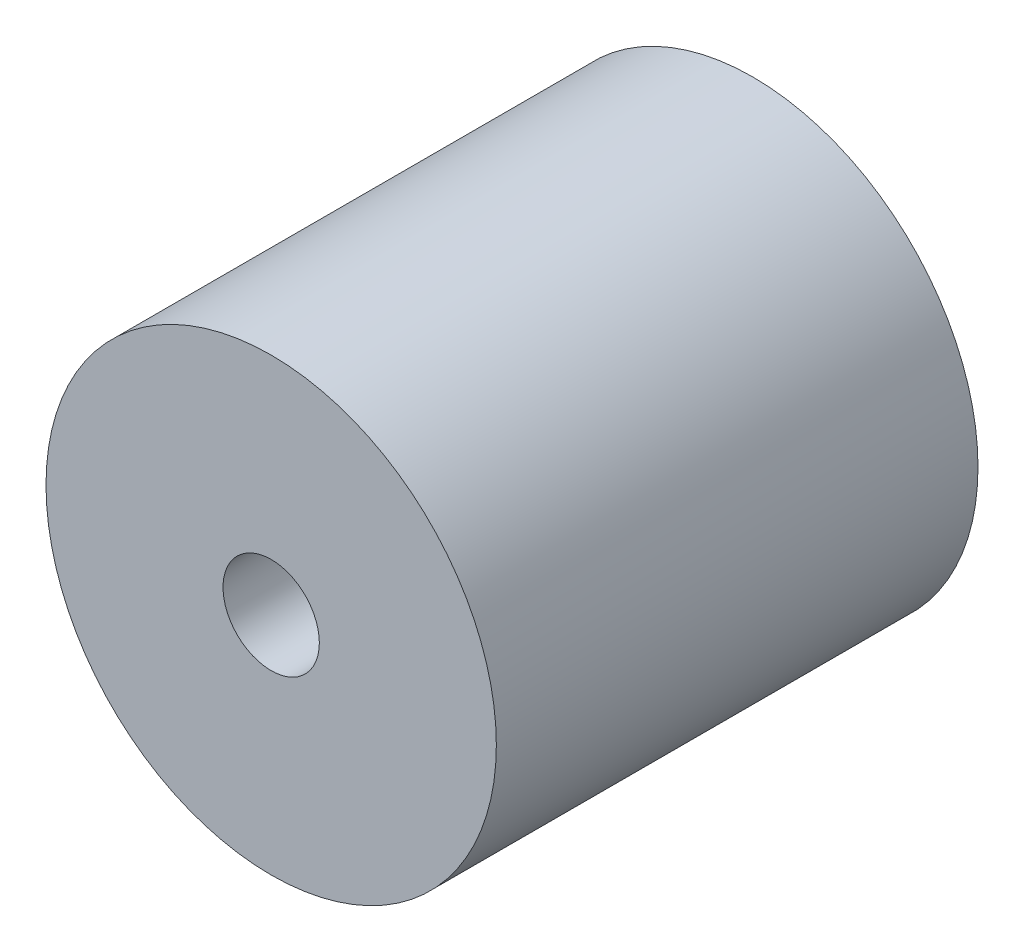
ISO-10303-21;
HEADER;
FILE_DESCRIPTION(('STEP AP214'),'2;1');
FILE_NAME('part.step','',(''),(''),'','','');
FILE_SCHEMA(('AUTOMOTIVE_DESIGN { 1 0 10303 214 1 1 1 1 }'));
ENDSEC;
DATA;
#1=APPLICATION_CONTEXT('core data for automotive mechanical design processes');
#2=APPLICATION_PROTOCOL_DEFINITION('international standard','automotive_design',2000,#1);
#3=PRODUCT_CONTEXT('',#1,'mechanical');
#4=PRODUCT('Part','Part','',(#3));
#5=PRODUCT_RELATED_PRODUCT_CATEGORY('part','',(#4));
#6=PRODUCT_DEFINITION_FORMATION('','',#4);
#7=PRODUCT_DEFINITION_CONTEXT('part definition',#1,'design');
#8=PRODUCT_DEFINITION('design','',#6,#7);
#9=PRODUCT_DEFINITION_SHAPE('','',#8);
#10=(LENGTH_UNIT() NAMED_UNIT(*) SI_UNIT(.MILLI.,.METRE.));
#11=(NAMED_UNIT(*) PLANE_ANGLE_UNIT() SI_UNIT($,.RADIAN.));
#12=(NAMED_UNIT(*) SI_UNIT($,.STERADIAN.) SOLID_ANGLE_UNIT());
#13=UNCERTAINTY_MEASURE_WITH_UNIT(LENGTH_MEASURE(1.E-05),#10,'distance_accuracy_value','');
#14=(GEOMETRIC_REPRESENTATION_CONTEXT(3) GLOBAL_UNCERTAINTY_ASSIGNED_CONTEXT((#13)) GLOBAL_UNIT_ASSIGNED_CONTEXT((#10,
#11,#12)) REPRESENTATION_CONTEXT('',''));
#15=CARTESIAN_POINT('',(0.,0.,0.));
#16=DIRECTION('',(0.,0.,1.));
#17=DIRECTION('',(1.,0.,0.));
#18=AXIS2_PLACEMENT_3D('',#15,#16,#17);
#19=CARTESIAN_POINT('',(0.,0.,20.));
#20=DIRECTION('',(0.,0.,-1.));
#21=DIRECTION('',(-1.,0.,0.));
#22=AXIS2_PLACEMENT_3D('',#19,#20,#21);
#23=CYLINDRICAL_SURFACE('',#22,9.35);
#24=CARTESIAN_POINT('',(0.,0.,20.));
#25=DIRECTION('',(0.,0.,1.));
#26=DIRECTION('',(1.,0.,0.));
#27=AXIS2_PLACEMENT_3D('',#24,#25,#26);
#28=CIRCLE('',#27,9.35);
#29=CARTESIAN_POINT('',(9.35,0.,20.));
#30=VERTEX_POINT('',#29);
#31=EDGE_CURVE('E10',#30,#30,#28,.T.);
#32=ORIENTED_EDGE('',*,*,#31,.F.);
#33=EDGE_LOOP('',(#32));
#34=FACE_BOUND('',#33,.T.);
#35=CARTESIAN_POINT('',(0.,0.,0.));
#36=DIRECTION('',(0.,0.,1.));
#37=DIRECTION('',(1.,0.,0.));
#38=AXIS2_PLACEMENT_3D('',#35,#36,#37);
#39=CIRCLE('',#38,9.35);
#40=CARTESIAN_POINT('',(9.35,0.,0.));
#41=VERTEX_POINT('',#40);
#42=EDGE_CURVE('E44',#41,#41,#39,.T.);
#43=ORIENTED_EDGE('',*,*,#42,.T.);
#44=EDGE_LOOP('',(#43));
#45=FACE_BOUND('',#44,.T.);
#46=ADVANCED_FACE('F41',(#34,#45),#23,.T.);
#47=CARTESIAN_POINT('',(0.,0.,20.));
#48=DIRECTION('',(0.,0.,1.));
#49=DIRECTION('',(1.,0.,0.));
#50=AXIS2_PLACEMENT_3D('',#47,#48,#49);
#51=PLANE('',#50);
#52=CARTESIAN_POINT('',(0.,0.,20.));
#53=DIRECTION('',(0.,0.,1.));
#54=DIRECTION('',(1.,0.,0.));
#55=AXIS2_PLACEMENT_3D('',#52,#53,#54);
#56=CIRCLE('',#55,2.);
#57=CARTESIAN_POINT('',(2.,0.,20.));
#58=VERTEX_POINT('',#57);
#59=EDGE_CURVE('E55',#58,#58,#56,.T.);
#60=ORIENTED_EDGE('',*,*,#59,.F.);
#61=EDGE_LOOP('',(#60));
#62=FACE_BOUND('',#61,.T.);
#63=ORIENTED_EDGE('',*,*,#31,.T.);
#64=EDGE_LOOP('',(#63));
#65=FACE_BOUND('',#64,.T.);
#66=ADVANCED_FACE('F72',(#62,#65),#51,.T.);
#67=CARTESIAN_POINT('',(0.,0.,0.));
#68=DIRECTION('',(0.,0.,1.));
#69=DIRECTION('',(1.,0.,0.));
#70=AXIS2_PLACEMENT_3D('',#67,#68,#69);
#71=PLANE('',#70);
#72=CARTESIAN_POINT('',(0.,0.,0.));
#73=DIRECTION('',(0.,0.,1.));
#74=DIRECTION('',(1.,0.,0.));
#75=AXIS2_PLACEMENT_3D('',#72,#73,#74);
#76=CIRCLE('',#75,2.);
#77=CARTESIAN_POINT('',(2.,0.,0.));
#78=VERTEX_POINT('',#77);
#79=EDGE_CURVE('E53',#78,#78,#76,.T.);
#80=ORIENTED_EDGE('',*,*,#79,.T.);
#81=EDGE_LOOP('',(#80));
#82=FACE_BOUND('',#81,.T.);
#83=ORIENTED_EDGE('',*,*,#42,.F.);
#84=EDGE_LOOP('',(#83));
#85=FACE_BOUND('',#84,.T.);
#86=ADVANCED_FACE('F63',(#82,#85),#71,.F.);
#87=CARTESIAN_POINT('',(0.,0.,0.));
#88=DIRECTION('',(0.,0.,1.));
#89=DIRECTION('',(1.,0.,0.));
#90=AXIS2_PLACEMENT_3D('',#87,#88,#89);
#91=CYLINDRICAL_SURFACE('',#90,2.);
#92=ORIENTED_EDGE('',*,*,#79,.F.);
#93=EDGE_LOOP('',(#92));
#94=FACE_BOUND('',#93,.T.);
#95=ORIENTED_EDGE('',*,*,#59,.T.);
#96=EDGE_LOOP('',(#95));
#97=FACE_BOUND('',#96,.T.);
#98=ADVANCED_FACE('F66',(#94,#97),#91,.F.);
#99=CLOSED_SHELL('',(#46,#66,#86,#98));
#100=MANIFOLD_SOLID_BREP('B2',#99);
#101=ADVANCED_BREP_SHAPE_REPRESENTATION('',(#18,#100),#14);
#102=SHAPE_DEFINITION_REPRESENTATION(#9,#101);
ENDSEC;
END-ISO-10303-21;
